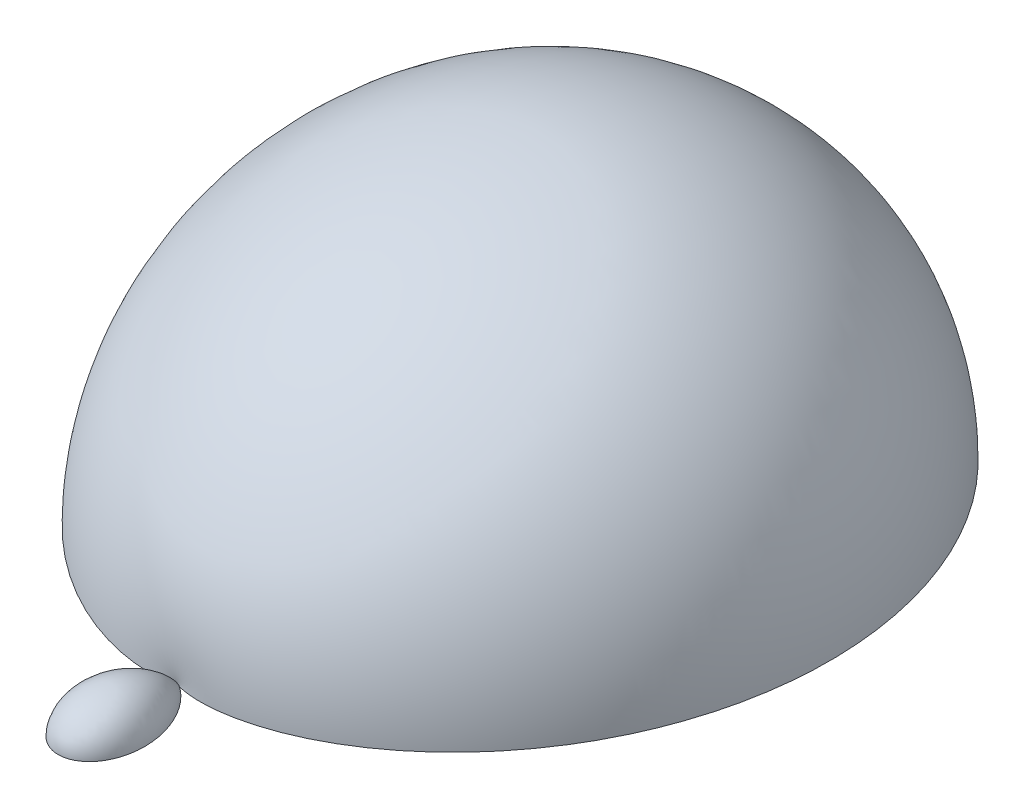
ISO-10303-21;
HEADER;
FILE_DESCRIPTION(('STEP AP214'),'2;1');
FILE_NAME('part.step','',(''),(''),'','','');
FILE_SCHEMA(('AUTOMOTIVE_DESIGN { 1 0 10303 214 1 1 1 1 }'));
ENDSEC;
DATA;
#1=APPLICATION_CONTEXT('core data for automotive mechanical design processes');
#2=APPLICATION_PROTOCOL_DEFINITION('international standard','automotive_design',2000,#1);
#3=PRODUCT_CONTEXT('',#1,'mechanical');
#4=PRODUCT('Part','Part','',(#3));
#5=PRODUCT_RELATED_PRODUCT_CATEGORY('part','',(#4));
#6=PRODUCT_DEFINITION_FORMATION('','',#4);
#7=PRODUCT_DEFINITION_CONTEXT('part definition',#1,'design');
#8=PRODUCT_DEFINITION('design','',#6,#7);
#9=PRODUCT_DEFINITION_SHAPE('','',#8);
#10=(LENGTH_UNIT() NAMED_UNIT(*) SI_UNIT(.MILLI.,.METRE.));
#11=(NAMED_UNIT(*) PLANE_ANGLE_UNIT() SI_UNIT($,.RADIAN.));
#12=(NAMED_UNIT(*) SI_UNIT($,.STERADIAN.) SOLID_ANGLE_UNIT());
#13=UNCERTAINTY_MEASURE_WITH_UNIT(LENGTH_MEASURE(1.E-05),#10,'distance_accuracy_value','');
#14=(GEOMETRIC_REPRESENTATION_CONTEXT(3) GLOBAL_UNCERTAINTY_ASSIGNED_CONTEXT((#13)) GLOBAL_UNIT_ASSIGNED_CONTEXT((#10,
#11,#12)) REPRESENTATION_CONTEXT('',''));
#15=CARTESIAN_POINT('',(0.,0.,0.));
#16=DIRECTION('',(0.,0.,1.));
#17=DIRECTION('',(1.,0.,0.));
#18=AXIS2_PLACEMENT_3D('',#15,#16,#17);
#19=CARTESIAN_POINT('',(3.0296110108049E-10,0.,55.7313000682652));
#20=CARTESIAN_POINT('',(-0.0598318973620608,0.,55.7313000682624));
#21=CARTESIAN_POINT('',(-0.179562729404567,0.,55.7304033513166));
#22=CARTESIAN_POINT('',(-0.390928619112989,0.,55.7263681246504));
#23=CARTESIAN_POINT('',(-0.656586719450777,0.,55.7156124664129));
#24=CARTESIAN_POINT('',(-0.979392234189975,0.,55.6954610347608));
#25=CARTESIAN_POINT('',(-1.37168870146057,0.,55.6605778212044));
#26=CARTESIAN_POINT('',(-1.7609011878045,0.,55.6123911231668));
#27=CARTESIAN_POINT('',(-2.1487141096828,0.,55.5510455910021));
#28=CARTESIAN_POINT('',(-2.53458864933454,0.,55.4792862304142));
#29=CARTESIAN_POINT('',(-3.1743671632355,0.,55.3424704848376));
#30=CARTESIAN_POINT('',(-4.12094692198827,0.,55.0799098799511));
#31=CARTESIAN_POINT('',(-5.22462288042269,0.,54.6623415449251));
#32=CARTESIAN_POINT('',(-6.39794578473312,0.,54.0796114542689));
#33=CARTESIAN_POINT('',(-7.40641288439091,0.,53.4700284851555));
#34=CARTESIAN_POINT('',(-8.26387846198917,0.,52.8685559155581));
#35=CARTESIAN_POINT('',(-9.08039031787511,0.,52.2126700568325));
#36=CARTESIAN_POINT('',(-9.85458290169099,0.,51.5074238091649));
#37=CARTESIAN_POINT('',(-10.7683992399558,0.,50.5701852688403));
#38=CARTESIAN_POINT('',(-11.7779347976951,0.,49.3654527937069));
#39=CARTESIAN_POINT('',(-12.7394186182445,0.,47.9894390705358));
#40=CARTESIAN_POINT('',(-13.6311429087017,0.,46.4447885132067));
#41=CARTESIAN_POINT('',(-14.4101885647117,-1.00625808928624E-13,44.8411287779078));
#42=CARTESIAN_POINT('',(-15.079747925479,-1.05301316955357E-13,43.1883973849908));
#43=CARTESIAN_POINT('',(-15.840993951943,-1.10617069546693E-13,40.8457985914059));
#44=CARTESIAN_POINT('',(-16.5178593300384,-1.1534359521975E-13,37.7735062069301));
#45=CARTESIAN_POINT('',(-16.9086340532858,-1.1807236052757E-13,34.1217026792431));
#46=CARTESIAN_POINT('',(-16.8565569889569,-1.17708708330998E-13,29.9265448193457));
#47=CARTESIAN_POINT('',(-16.3459886519928,-1.14143428689569E-13,25.7634454359233));
#48=CARTESIAN_POINT('',(-15.4095986370584,-1.07604652163524E-13,21.6757938244161));
#49=CARTESIAN_POINT('',(-14.07342410912,0.,17.7012289142145));
#50=CARTESIAN_POINT('',(-12.3574352463093,0.,13.875415386345));
#51=CARTESIAN_POINT('',(-10.2758005836962,0.,10.2352499619962));
#52=CARTESIAN_POINT('',(-8.1409328517767,0.,7.2503769924208));
#53=CARTESIAN_POINT('',(-6.08626954255194,0.,4.87052336473417));
#54=CARTESIAN_POINT('',(-4.35575110081088,0.,3.17122470375911));
#55=CARTESIAN_POINT('',(-3.0659045402937,0.,2.05080314218492));
#56=CARTESIAN_POINT('',(-1.97446622885493,0.,1.21508249233989));
#57=CARTESIAN_POINT('',(-1.19371296091612,0.,0.680668395581493));
#58=CARTESIAN_POINT('',(-0.587508960420668,0.,0.310465880760851));
#59=CARTESIAN_POINT('',(-0.255429091361777,0.,0.125951121733829));
#60=CARTESIAN_POINT('',(-0.0857836900612002,0.,0.0407232603096124));
#61=CARTESIAN_POINT('',(4.03935597463215E-10,0.,0.));
#62=B_SPLINE_CURVE_WITH_KNOTS('',4,(#19,#20,#21,#22,#23,#24,#25,#26,#27,#28,#29,#30,#31,#32,#33,
#34,#35,#36,#37,#38,#39,#40,#41,#42,#43,#44,#45,#46,#47,#48,#49,#50,#51,#52,#53,#54,#55,#56,#57,
#58,#59,#60,#61),.UNSPECIFIED.,.F.,.F.,(5,1,1,1,1,1,1,1,1,1,1,1,1,1,1,1,1,1,1,1,1,1,1,1,1,1,1,1,
1,1,1,1,1,1,1,1,1,1,1,5),(0.0853246715427618,0.0887485509040368,0.0921724302653117,
0.0955963096265867,0.0990201889878616,0.105867947710412,0.112715706432961,0.116139589732041,
0.119563473031121,0.12641123962928,0.14695454522692,0.167497862430884,0.181193345776511,
0.194888829122138,0.208584415628072,0.222280002134007,0.235975530838741,0.249671059543476,
0.277062180815685,0.304453170294509,0.323693004216435,0.342932838138361,0.370323926496127,
0.397715014853894,0.45249719417462,0.507279373703119,0.562061567924162,0.616843748917064,
0.67162593046471,0.726408051134821,0.781190345492604,0.835972549580629,0.8907546682956,
0.918145813941736,0.945536959587871,0.962830449785445,0.980123939983018,0.990061969991509,
0.995030984995754,1.),.UNSPECIFIED.);
#63=CARTESIAN_POINT('',(4.0392877234739E-10,0.,0.));
#64=DIRECTION('',(0.,0.,-1.));
#65=AXIS1_PLACEMENT('',#63,#64);
#66=SURFACE_OF_REVOLUTION('',#62,#65);
#67=CARTESIAN_POINT('',(5.0491009384594E-10,0.,55.7313000682652));
#68=CARTESIAN_POINT('',(0.059831898169932,0.,55.7313000682624));
#69=CARTESIAN_POINT('',(0.179562730212438,0.,55.7304033513166));
#70=CARTESIAN_POINT('',(0.39092861992086,0.,55.7263681246504));
#71=CARTESIAN_POINT('',(0.656586720258649,0.,55.7156124664129));
#72=CARTESIAN_POINT('',(0.979392234997847,0.,55.6954610347608));
#73=CARTESIAN_POINT('',(1.37168870226844,0.,55.6605778212044));
#74=CARTESIAN_POINT('',(1.76090118861237,0.,55.6123911231668));
#75=CARTESIAN_POINT('',(2.14871411049067,0.,55.5510455910021));
#76=CARTESIAN_POINT('',(2.53458865014241,0.,55.4792862304142));
#77=CARTESIAN_POINT('',(3.17436716404337,0.,55.3424704848376));
#78=CARTESIAN_POINT('',(4.12094692279614,0.,55.0799098799511));
#79=CARTESIAN_POINT('',(5.22462288123056,0.,54.6623415449251));
#80=CARTESIAN_POINT('',(6.39794578554099,0.,54.0796114542689));
#81=CARTESIAN_POINT('',(7.40641288519878,0.,53.4700284851555));
#82=CARTESIAN_POINT('',(8.26387846279704,0.,52.8685559155581));
#83=CARTESIAN_POINT('',(9.08039031868298,0.,52.2126700568325));
#84=CARTESIAN_POINT('',(9.85458290249885,0.,51.5074238091649));
#85=CARTESIAN_POINT('',(10.7683992407637,0.,50.5701852688403));
#86=CARTESIAN_POINT('',(11.7779347985029,0.,49.3654527937069));
#87=CARTESIAN_POINT('',(12.7394186190524,0.,47.9894390705358));
#88=CARTESIAN_POINT('',(13.6311429095096,0.,46.4447885132067));
#89=CARTESIAN_POINT('',(14.4101885655196,0.,44.8411287779078));
#90=CARTESIAN_POINT('',(15.0797479262868,0.,43.1883973849907));
#91=CARTESIAN_POINT('',(15.8409939527509,0.,40.8457985914058));
#92=CARTESIAN_POINT('',(16.5178593308462,0.,37.7735062069301));
#93=CARTESIAN_POINT('',(16.9086340540936,0.,34.1217026792431));
#94=CARTESIAN_POINT('',(16.8565569897648,0.,29.9265448193457));
#95=CARTESIAN_POINT('',(16.3459886528006,0.,25.7634454359233));
#96=CARTESIAN_POINT('',(15.4095986378662,0.,21.6757938244161));
#97=CARTESIAN_POINT('',(14.0734241099278,0.,17.7012289142145));
#98=CARTESIAN_POINT('',(12.3574352471172,0.,13.875415386345));
#99=CARTESIAN_POINT('',(10.2758005845041,0.,10.2352499619962));
#100=CARTESIAN_POINT('',(8.14093285258456,0.,7.2503769924208));
#101=CARTESIAN_POINT('',(6.0862695433598,0.,4.87052336473417));
#102=CARTESIAN_POINT('',(4.35575110161874,0.,3.17122470375911));
#103=CARTESIAN_POINT('',(3.06590454110155,0.,2.05080314218492));
#104=CARTESIAN_POINT('',(1.97446622966279,0.,1.21508249233989));
#105=CARTESIAN_POINT('',(1.19371296172398,0.,0.680668395581493));
#106=CARTESIAN_POINT('',(0.587508961228526,0.,0.31046588076085));
#107=CARTESIAN_POINT('',(0.255429092169634,0.,0.125951121733829));
#108=CARTESIAN_POINT('',(0.0857836908690578,0.,0.0407232603096124));
#109=CARTESIAN_POINT('',(4.03921947231566E-10,0.,0.));
#110=B_SPLINE_CURVE_WITH_KNOTS('',4,(#67,#68,#69,#70,#71,#72,#73,#74,#75,#76,#77,#78,#79,#80,
#81,#82,#83,#84,#85,#86,#87,#88,#89,#90,#91,#92,#93,#94,#95,#96,#97,#98,#99,#100,#101,#102,#103,
#104,#105,#106,#107,#108,#109),.UNSPECIFIED.,.F.,.F.,(5,1,1,1,1,1,1,1,1,1,1,1,1,1,1,1,1,1,1,1,1,
1,1,1,1,1,1,1,1,1,1,1,1,1,1,1,1,1,1,5),(0.0853246715427618,0.0887485509040368,
0.0921724302653117,0.0955963096265867,0.0990201889878616,0.105867947710412,0.112715706432961,
0.116139589732041,0.119563473031121,0.12641123962928,0.14695454522692,0.167497862430884,
0.181193345776511,0.194888829122138,0.208584415628072,0.222280002134007,0.235975530838741,
0.249671059543476,0.277062180815685,0.304453170294509,0.323693004216435,0.342932838138361,
0.370323926496127,0.397715014853894,0.45249719417462,0.507279373703119,0.562061567924162,
0.616843748917064,0.67162593046471,0.726408051134821,0.781190345492604,0.835972549580629,
0.8907546682956,0.918145813941736,0.945536959587871,0.962830449785445,0.980123939983018,
0.990061969991509,0.995030984995754,1.),.UNSPECIFIED.);
#111=CARTESIAN_POINT('',(4.03942422579039E-10,0.,55.7313000682652));
#112=VERTEX_POINT('',#111);
#113=CARTESIAN_POINT('',(4.0392877234739E-10,0.,0.));
#114=VERTEX_POINT('',#113);
#115=EDGE_CURVE('P0_E26',#112,#114,#110,.T.);
#116=ORIENTED_EDGE('',*,*,#115,.T.);
#117=EDGE_CURVE('P0_E10',#112,#114,#62,.T.);
#118=ORIENTED_EDGE('',*,*,#117,.F.);
#119=EDGE_LOOP('',(#116,#118));
#120=FACE_BOUND('',#119,.T.);
#121=ADVANCED_FACE('P0_F16',(#120),#66,.T.);
#122=CARTESIAN_POINT('',(-16.7153290819015,-1.16722519126983E-13,29.32417466702));
#123=DIRECTION('',(0.,1.,0.));
#124=DIRECTION('',(0.,0.,-1.));
#125=AXIS2_PLACEMENT_3D('',#122,#123,#124);
#126=PLANE('',#125);
#127=ORIENTED_EDGE('',*,*,#117,.T.);
#128=ORIENTED_EDGE('',*,*,#115,.F.);
#129=EDGE_LOOP('',(#127,#128));
#130=FACE_BOUND('',#129,.T.);
#131=ADVANCED_FACE('P0_F33',(#130),#126,.F.);
#132=CLOSED_SHELL('',(#121,#131));
#133=MANIFOLD_SOLID_BREP('P0_B1',#132);
#134=CARTESIAN_POINT('',(-1.28952789133778E-12,0.,2.22024276134319E-13));
#135=CARTESIAN_POINT('',(-0.06179640236384,0.,0.0260844688334479));
#136=CARTESIAN_POINT('',(-0.186171395575703,0.,0.0762625521816578));
#137=CARTESIAN_POINT('',(-0.438119474180359,0.,0.168499763814137));
#138=CARTESIAN_POINT('',(-0.820492001152202,0.,0.294039894972148));
#139=CARTESIAN_POINT('',(-1.27066955731304,0.,0.427306606281505));
#140=CARTESIAN_POINT('',(-1.91897097816666,0.,0.599190094761069));
#141=CARTESIAN_POINT('',(-2.70310150271063,0.,0.780777898401231));
#142=CARTESIAN_POINT('',(-3.62441208212806,0.,0.962503808624495));
#143=CARTESIAN_POINT('',(-4.68357385300178,0.,1.1351964344105));
#144=CARTESIAN_POINT('',(-6.01322010812983,0.,1.31237873441982));
#145=CARTESIAN_POINT('',(-7.75032829028758,0.,1.48231120858637));
#146=CARTESIAN_POINT('',(-9.89658985145064,0.,1.60120276121436));
#147=CARTESIAN_POINT('',(-12.4498657433919,0.,1.62398658026433));
#148=CARTESIAN_POINT('',(-15.1369496597972,-1.05700754528387E-13,1.52969612808145));
#149=CARTESIAN_POINT('',(-18.0288321311514,-1.25894661894108E-13,1.31265298735145));
#150=CARTESIAN_POINT('',(-21.1196708725397,-1.47477873467969E-13,0.954329211181484));
#151=CARTESIAN_POINT('',(-25.2750537376473,-1.76494756926513E-13,0.299686803731429));
#152=CARTESIAN_POINT('',(-30.4607438328889,-2.12706237319632E-13,-0.81091711414811));
#153=CARTESIAN_POINT('',(-36.4201711544256,-2.54320695886306E-13,-2.47836137878461));
#154=CARTESIAN_POINT('',(-44.7537489308445,-3.12513758470636E-13,-5.42538740152839));
#155=CARTESIAN_POINT('',(-54.2102941136212,-3.78548460541819E-13,-9.67394425021917));
#156=CARTESIAN_POINT('',(-64.5738939753337,-4.50917091582631E-13,-15.5079300826641));
#157=CARTESIAN_POINT('',(-75.7699036371996,-5.29098409190456E-13,-23.3303303746191));
#158=CARTESIAN_POINT('',(-86.2103334549603,-6.02003540946881E-13,-32.1343057947496));
#159=CARTESIAN_POINT('',(-98.5039518203577,-6.8784941916617E-13,-44.5071740632754));
#160=CARTESIAN_POINT('',(-111.658349980372,-7.79706090564974E-13,-61.2075163833376));
#161=CARTESIAN_POINT('',(-124.217702924828,-8.67407583432001E-13,-82.6380961051158));
#162=CARTESIAN_POINT('',(-134.511740749559,-9.39290465364787E-13,-109.088749805089));
#163=CARTESIAN_POINT('',(-140.539244653395,-9.81380300164882E-13,-136.823984777638));
#164=CARTESIAN_POINT('',(-142.124712042351,-9.9245155976865E-13,-165.165585837076));
#165=CARTESIAN_POINT('',(-139.50892139234,-9.74185591286976E-13,-189.870900705308));
#166=CARTESIAN_POINT('',(-134.364211850869,-9.38260276571349E-13,-210.498439849096));
#167=CARTESIAN_POINT('',(-128.771836165655,-8.99208925881897E-13,-225.40350569829));
#168=CARTESIAN_POINT('',(-124.328767006836,-8.68183139771491E-13,-235.03610167598));
#169=CARTESIAN_POINT('',(-120.156246067565,-8.39046581780693E-13,-242.825005819961));
#170=CARTESIAN_POINT('',(-116.539727952504,-8.13792570760046E-13,-248.89877573355));
#171=CARTESIAN_POINT('',(-111.676015438397,-7.79829447799045E-13,-256.27602148303));
#172=CARTESIAN_POINT('',(-106.363151586266,-7.42729917807986E-13,-263.342091752904));
#173=CARTESIAN_POINT('',(-100.615477372437,-7.02594123289312E-13,-270.059819182962));
#174=CARTESIAN_POINT('',(-94.4519959538815,-6.59554762578928E-13,-276.392003819387));
#175=CARTESIAN_POINT('',(-89.2803230591486,-6.23441163773807E-13,-281.211675458327));
#176=CARTESIAN_POINT('',(-83.8773840593005,-5.85712642388052E-13,-285.770690998166));
#177=CARTESIAN_POINT('',(-78.2538642418096,-5.46443813385284E-13,-290.054769276042));
#178=CARTESIAN_POINT('',(-72.6220516987174,-5.07117076589146E-13,-293.912641916345));
#179=CARTESIAN_POINT('',(-67.0166457161591,-4.67974735819662E-13,-297.364605166201));
#180=CARTESIAN_POINT('',(-61.4691034724037,-4.2923645537863E-13,-300.43322908842));
#181=CARTESIAN_POINT('',(-56.0076441886356,-3.91099289034374E-13,-303.14277221305));
#182=CARTESIAN_POINT('',(-51.0156751631169,-3.56240555641011E-13,-305.345016608043));
#183=CARTESIAN_POINT('',(-46.5378940026813,-3.24972376918842E-13,-307.115144280776));
#184=CARTESIAN_POINT('',(-42.6077970419,-2.97528656522018E-13,-308.521431149217));
#185=CARTESIAN_POINT('',(-39.2503955393763,-2.74084047135888E-13,-309.623285068521));
#186=CARTESIAN_POINT('',(-35.8646255351497,-2.50441341561144E-13,-310.635404654443));
#187=CARTESIAN_POINT('',(-32.4534517287689,-2.26621242184085E-13,-311.55680384421));
#188=CARTESIAN_POINT('',(-29.0181594992808,-2.02632724758624E-13,-312.386577485599));
#189=CARTESIAN_POINT('',(-25.5629724600658,-1.7850528261936E-13,-313.123904135397));
#190=CARTESIAN_POINT('',(-22.0873174173519,-1.54234913175577E-13,-313.76804893255));
#191=CARTESIAN_POINT('',(-18.5988137561726,-1.2987482230859E-13,-314.318365892782));
#192=CARTESIAN_POINT('',(-15.5292459825337,-1.08440145108641E-13,-314.717308437183));
#193=CARTESIAN_POINT('',(-12.8996785579057,0.,-314.999981496043));
#194=CARTESIAN_POINT('',(-10.6912295027758,0.,-315.195909234741));
#195=CARTESIAN_POINT('',(-8.94655489390642,0.,-315.328831667363));
#196=CARTESIAN_POINT('',(-7.19968247713577,0.,-315.43491110831));
#197=CARTESIAN_POINT('',(-5.58657572925251,0.,-315.516253721295));
#198=CARTESIAN_POINT('',(-3.87399750218016,0.,-315.574904238221));
#199=CARTESIAN_POINT('',(-2.46068837972842,0.,-315.612843310033));
#200=CARTESIAN_POINT('',(-1.07354269719657,0.,-315.627071903228));
#201=CARTESIAN_POINT('',(-0.357487537177925,0.,-315.630233812828));
#202=CARTESIAN_POINT('',(1.32640163637113E-09,0.,-315.630233812824));
#203=B_SPLINE_CURVE_WITH_KNOTS('',4,(#134,#135,#136,#137,#138,#139,#140,#141,#142,#143,#144,
#145,#146,#147,#148,#149,#150,#151,#152,#153,#154,#155,#156,#157,#158,#159,#160,#161,#162,#163,
#164,#165,#166,#167,#168,#169,#170,#171,#172,#173,#174,#175,#176,#177,#178,#179,#180,#181,#182,
#183,#184,#185,#186,#187,#188,#189,#190,#191,#192,#193,#194,#195,#196,#197,#198,#199,#200,#201,
#202),.UNSPECIFIED.,.F.,.F.,(5,1,1,1,1,1,1,1,1,1,1,1,1,1,1,1,1,1,1,1,1,1,1,1,1,1,1,1,1,1,1,1,1,
1,1,1,1,1,1,1,1,1,1,1,1,1,1,1,1,1,1,1,1,1,1,1,1,1,1,1,1,1,1,1,1,5),(0.,0.000516629126413912,
0.00103325825282782,0.00206651650565565,0.00309977475848347,0.0041330330113113,
0.00619954951696695,0.0082660660226226,0.0103325825282782,0.0123990990339339,0.0165321320452452,
0.0217090294384098,0.0268859268315743,0.0320628242247389,0.0372397216179034,0.0440448451817518,
0.0508499687456003,0.0644602158732971,0.0780700444307127,0.0916798729881284,0.118899192257916,
0.144215766640906,0.169532341023895,0.196751872216609,0.223971403409322,0.278410539535434,
0.332849765401117,0.387288816168775,0.441727967572643,0.496167108717227,0.550606220608444,
0.577825778900488,0.605045337192532,0.618655116625288,0.632264896058044,0.6458746754908,
0.659484454923556,0.686704005867329,0.700313781339215,0.713923556811101,0.727533334790562,
0.741143112770022,0.754752890749482,0.768362668728942,0.780100637774014,0.791838606819085,
0.803576575864156,0.815314544909227,0.822119434447002,0.828924323984777,0.835729213522551,
0.842534103060326,0.849338991210889,0.856143879361452,0.862948767512016,0.869753655662579,
0.876558544765072,0.883363433867566,0.886765878418812,0.890168322970059,0.893570767521306,
0.896973212072553,0.900002638615908,0.903032065159263,0.906061491702619,0.909090918245974),.UNSPECIFIED.);
#204=CARTESIAN_POINT('',(-1.38520380062119E-13,0.,-315.630233812824));
#205=DIRECTION('',(0.,0.,-1.));
#206=AXIS1_PLACEMENT('',#204,#205);
#207=SURFACE_OF_REVOLUTION('',#203,#206);
#208=CARTESIAN_POINT('',(3.17786771832258E-12,0.,2.22024276134297E-13));
#209=CARTESIAN_POINT('',(0.0617964023657285,0.,0.0260844688334474));
#210=CARTESIAN_POINT('',(0.186171395577592,0.,0.0762625521816566));
#211=CARTESIAN_POINT('',(0.438119474182249,0.,0.168499763814134));
#212=CARTESIAN_POINT('',(0.820492001154093,0.,0.294039894972143));
#213=CARTESIAN_POINT('',(1.27066955731493,0.,0.427306606281497));
#214=CARTESIAN_POINT('',(1.91897097816855,0.,0.599190094761056));
#215=CARTESIAN_POINT('',(2.70310150271252,0.,0.780777898401212));
#216=CARTESIAN_POINT('',(3.62441208212995,0.,0.96250380862447));
#217=CARTESIAN_POINT('',(4.68357385300367,0.,1.13519643441047));
#218=CARTESIAN_POINT('',(6.01322010813173,0.,1.31237873441978));
#219=CARTESIAN_POINT('',(7.75032829028948,0.,1.48231120858632));
#220=CARTESIAN_POINT('',(9.89658985145254,0.,1.60120276121429));
#221=CARTESIAN_POINT('',(12.4498657433938,0.,1.62398658026424));
#222=CARTESIAN_POINT('',(15.1369496597991,0.,1.52969612808134));
#223=CARTESIAN_POINT('',(18.0288321311533,0.,1.31265298735133));
#224=CARTESIAN_POINT('',(21.1196708725416,0.,0.954329211181339));
#225=CARTESIAN_POINT('',(25.2750537376492,0.,0.299686803731255));
#226=CARTESIAN_POINT('',(30.4607438328908,0.,-0.810917114148319));
#227=CARTESIAN_POINT('',(36.4201711544274,0.,-2.47836137878486));
#228=CARTESIAN_POINT('',(44.7537489308464,0.,-5.42538740152869));
#229=CARTESIAN_POINT('',(54.210294113623,0.,-9.67394425021954));
#230=CARTESIAN_POINT('',(64.5738939753355,0.,-15.5079300826646));
#231=CARTESIAN_POINT('',(75.7699036372014,0.,-23.3303303746196));
#232=CARTESIAN_POINT('',(86.2103334549619,0.,-32.1343057947501));
#233=CARTESIAN_POINT('',(98.5039518203593,0.,-44.507174063276));
#234=CARTESIAN_POINT('',(111.658349980374,0.,-61.2075163833384));
#235=CARTESIAN_POINT('',(124.21770292483,0.,-82.6380961051167));
#236=CARTESIAN_POINT('',(134.51174074956,0.,-109.08874980509));
#237=CARTESIAN_POINT('',(140.539244653396,0.,-136.823984777639));
#238=CARTESIAN_POINT('',(142.124712042352,0.,-165.165585837077));
#239=CARTESIAN_POINT('',(139.50892139234,0.,-189.870900705309));
#240=CARTESIAN_POINT('',(134.364211850869,0.,-210.498439849097));
#241=CARTESIAN_POINT('',(128.771836165655,0.,-225.403505698291));
#242=CARTESIAN_POINT('',(124.328767006837,0.,-235.036101675981));
#243=CARTESIAN_POINT('',(120.156246067565,0.,-242.825005819961));
#244=CARTESIAN_POINT('',(116.539727952504,0.,-248.898775733551));
#245=CARTESIAN_POINT('',(111.676015438398,0.,-256.27602148303));
#246=CARTESIAN_POINT('',(106.363151586267,0.,-263.342091752905));
#247=CARTESIAN_POINT('',(100.615477372437,0.,-270.059819182963));
#248=CARTESIAN_POINT('',(94.4519959538815,0.,-276.392003819388));
#249=CARTESIAN_POINT('',(89.2803230591485,0.,-281.211675458327));
#250=CARTESIAN_POINT('',(83.8773840593004,0.,-285.770690998167));
#251=CARTESIAN_POINT('',(78.2538642418095,0.,-290.054769276043));
#252=CARTESIAN_POINT('',(72.6220516987173,0.,-293.912641916345));
#253=CARTESIAN_POINT('',(67.016645716159,0.,-297.364605166202));
#254=CARTESIAN_POINT('',(61.4691034724035,0.,-300.43322908842));
#255=CARTESIAN_POINT('',(56.0076441886354,0.,-303.142772213051));
#256=CARTESIAN_POINT('',(51.0156751631167,0.,-305.345016608044));
#257=CARTESIAN_POINT('',(46.5378940026811,0.,-307.115144280777));
#258=CARTESIAN_POINT('',(42.6077970418998,0.,-308.521431149218));
#259=CARTESIAN_POINT('',(39.2503955393761,0.,-309.623285068522));
#260=CARTESIAN_POINT('',(35.8646255351495,0.,-310.635404654443));
#261=CARTESIAN_POINT('',(32.4534517287686,0.,-311.55680384421));
#262=CARTESIAN_POINT('',(29.0181594992805,0.,-312.386577485599));
#263=CARTESIAN_POINT('',(25.5629724600655,0.,-313.123904135397));
#264=CARTESIAN_POINT('',(22.0873174173516,0.,-313.76804893255));
#265=CARTESIAN_POINT('',(18.5988137561723,0.,-314.318365892782));
#266=CARTESIAN_POINT('',(15.5292459825334,0.,-314.717308437183));
#267=CARTESIAN_POINT('',(12.8996785579054,0.,-314.999981496043));
#268=CARTESIAN_POINT('',(10.6912295027755,0.,-315.195909234741));
#269=CARTESIAN_POINT('',(8.94655489390614,0.,-315.328831667363));
#270=CARTESIAN_POINT('',(7.19968247713549,0.,-315.43491110831));
#271=CARTESIAN_POINT('',(5.58657572925223,0.,-315.516253721295));
#272=CARTESIAN_POINT('',(3.87399750217988,0.,-315.574904238221));
#273=CARTESIAN_POINT('',(2.46068837972814,0.,-315.612843310033));
#274=CARTESIAN_POINT('',(1.0735426971963,0.,-315.627071903228));
#275=CARTESIAN_POINT('',(0.357487537177648,0.,-315.630233812828));
#276=CARTESIAN_POINT('',(-1.32667867713125E-09,0.,-315.630233812824));
#277=B_SPLINE_CURVE_WITH_KNOTS('',4,(#208,#209,#210,#211,#212,#213,#214,#215,#216,#217,#218,
#219,#220,#221,#222,#223,#224,#225,#226,#227,#228,#229,#230,#231,#232,#233,#234,#235,#236,#237,
#238,#239,#240,#241,#242,#243,#244,#245,#246,#247,#248,#249,#250,#251,#252,#253,#254,#255,#256,
#257,#258,#259,#260,#261,#262,#263,#264,#265,#266,#267,#268,#269,#270,#271,#272,#273,#274,#275,
#276),.UNSPECIFIED.,.F.,.F.,(5,1,1,1,1,1,1,1,1,1,1,1,1,1,1,1,1,1,1,1,1,1,1,1,1,1,1,1,1,1,1,1,1,
1,1,1,1,1,1,1,1,1,1,1,1,1,1,1,1,1,1,1,1,1,1,1,1,1,1,1,1,1,1,1,1,5),(0.,0.000516629126413912,
0.00103325825282782,0.00206651650565565,0.00309977475848347,0.0041330330113113,
0.00619954951696695,0.0082660660226226,0.0103325825282782,0.0123990990339339,0.0165321320452452,
0.0217090294384098,0.0268859268315743,0.0320628242247389,0.0372397216179034,0.0440448451817518,
0.0508499687456003,0.0644602158732971,0.0780700444307127,0.0916798729881284,0.118899192257916,
0.144215766640906,0.169532341023895,0.196751872216609,0.223971403409322,0.278410539535434,
0.332849765401117,0.387288816168775,0.441727967572643,0.496167108717227,0.550606220608444,
0.577825778900488,0.605045337192532,0.618655116625288,0.632264896058044,0.6458746754908,
0.659484454923556,0.686704005867329,0.700313781339215,0.713923556811101,0.727533334790562,
0.741143112770022,0.754752890749482,0.768362668728942,0.780100637774014,0.791838606819085,
0.803576575864156,0.815314544909227,0.822119434447002,0.828924323984777,0.835729213522551,
0.842534103060326,0.849338991210889,0.856143879361452,0.862948767512016,0.869753655662579,
0.876558544765072,0.883363433867566,0.886765878418812,0.890168322970059,0.893570767521306,
0.896973212072553,0.900002638615908,0.903032065159263,0.906061491702619,0.909090918245974),.UNSPECIFIED.);
#278=CARTESIAN_POINT('',(-1.28952789133778E-12,0.,2.22024276134319E-13));
#279=VERTEX_POINT('',#278);
#280=CARTESIAN_POINT('',(-1.38520380062119E-13,0.,-315.630233812824));
#281=VERTEX_POINT('',#280);
#282=EDGE_CURVE('P1_E27',#279,#281,#277,.T.);
#283=ORIENTED_EDGE('',*,*,#282,.T.);
#284=EDGE_CURVE('P1_E11',#279,#281,#203,.T.);
#285=ORIENTED_EDGE('',*,*,#284,.F.);
#286=EDGE_LOOP('',(#283,#285));
#287=FACE_BOUND('',#286,.T.);
#288=ADVANCED_FACE('P1_F17',(#287),#207,.T.);
#289=CARTESIAN_POINT('',(-141.199102746596,-9.85988064602274E-13,-157.6658890672));
#290=DIRECTION('',(0.,1.,0.));
#291=DIRECTION('',(0.,0.,-1.));
#292=AXIS2_PLACEMENT_3D('',#289,#290,#291);
#293=PLANE('',#292);
#294=ORIENTED_EDGE('',*,*,#284,.T.);
#295=ORIENTED_EDGE('',*,*,#282,.F.);
#296=EDGE_LOOP('',(#294,#295));
#297=FACE_BOUND('',#296,.T.);
#298=ADVANCED_FACE('P1_F34',(#297),#293,.F.);
#299=CLOSED_SHELL('',(#288,#298));
#300=MANIFOLD_SOLID_BREP('P1_B1',#299);
#301=ADVANCED_BREP_SHAPE_REPRESENTATION('',(#18,#133,#300),#14);
#302=SHAPE_DEFINITION_REPRESENTATION(#9,#301);
ENDSEC;
END-ISO-10303-21;
